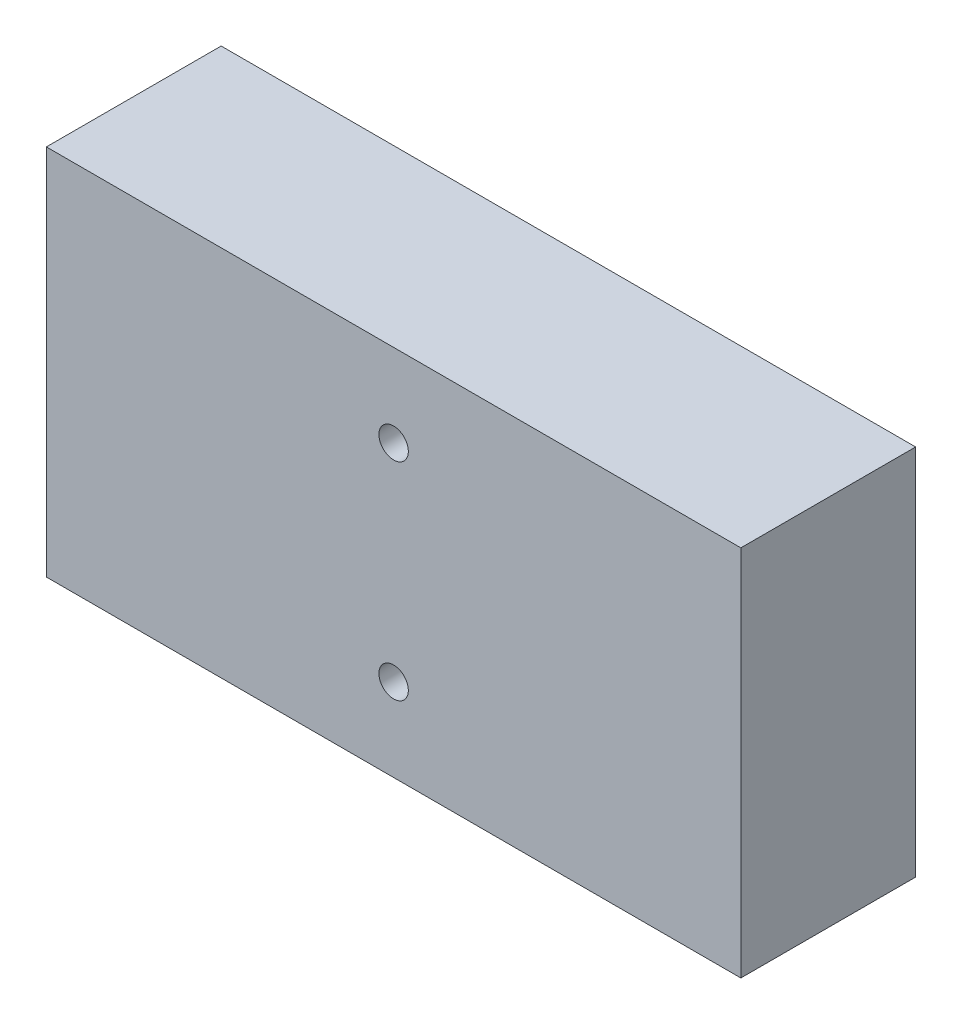
ISO-10303-21;
HEADER;
FILE_DESCRIPTION(('STEP AP214'),'2;1');
FILE_NAME('part.step','',(''),(''),'','','');
FILE_SCHEMA(('AUTOMOTIVE_DESIGN { 1 0 10303 214 1 1 1 1 }'));
ENDSEC;
DATA;
#1=APPLICATION_CONTEXT('core data for automotive mechanical design processes');
#2=APPLICATION_PROTOCOL_DEFINITION('international standard','automotive_design',2000,#1);
#3=PRODUCT_CONTEXT('',#1,'mechanical');
#4=PRODUCT('Part','Part','',(#3));
#5=PRODUCT_RELATED_PRODUCT_CATEGORY('part','',(#4));
#6=PRODUCT_DEFINITION_FORMATION('','',#4);
#7=PRODUCT_DEFINITION_CONTEXT('part definition',#1,'design');
#8=PRODUCT_DEFINITION('design','',#6,#7);
#9=PRODUCT_DEFINITION_SHAPE('','',#8);
#10=(LENGTH_UNIT() NAMED_UNIT(*) SI_UNIT(.MILLI.,.METRE.));
#11=(NAMED_UNIT(*) PLANE_ANGLE_UNIT() SI_UNIT($,.RADIAN.));
#12=(NAMED_UNIT(*) SI_UNIT($,.STERADIAN.) SOLID_ANGLE_UNIT());
#13=UNCERTAINTY_MEASURE_WITH_UNIT(LENGTH_MEASURE(1.E-05),#10,'distance_accuracy_value','');
#14=(GEOMETRIC_REPRESENTATION_CONTEXT(3) GLOBAL_UNCERTAINTY_ASSIGNED_CONTEXT((#13)) GLOBAL_UNIT_ASSIGNED_CONTEXT((#10,
#11,#12)) REPRESENTATION_CONTEXT('',''));
#15=CARTESIAN_POINT('',(0.,0.,0.));
#16=DIRECTION('',(0.,0.,1.));
#17=DIRECTION('',(1.,0.,0.));
#18=AXIS2_PLACEMENT_3D('',#15,#16,#17);
#19=CARTESIAN_POINT('',(0.,0.,19.));
#20=DIRECTION('',(0.,0.,-1.));
#21=DIRECTION('',(-1.,0.,0.));
#22=AXIS2_PLACEMENT_3D('',#19,#20,#21);
#23=PLANE('',#22);
#24=DIRECTION('',(0.,1.,0.));
#25=VECTOR('',#24,1.);
#26=CARTESIAN_POINT('',(37.75,-20.25,19.));
#27=LINE('',#26,#25);
#28=CARTESIAN_POINT('',(37.75,-20.25,19.));
#29=VERTEX_POINT('',#28);
#30=CARTESIAN_POINT('',(37.75,20.25,19.));
#31=VERTEX_POINT('',#30);
#32=EDGE_CURVE('E91',#29,#31,#27,.T.);
#33=ORIENTED_EDGE('',*,*,#32,.T.);
#34=DIRECTION('',(-1.,0.,0.));
#35=VECTOR('',#34,1.);
#36=CARTESIAN_POINT('',(-37.75,20.25,19.));
#37=LINE('',#36,#35);
#38=CARTESIAN_POINT('',(-37.75,20.25,19.));
#39=VERTEX_POINT('',#38);
#40=EDGE_CURVE('E86',#31,#39,#37,.T.);
#41=ORIENTED_EDGE('',*,*,#40,.T.);
#42=DIRECTION('',(0.,-1.,0.));
#43=VECTOR('',#42,1.);
#44=CARTESIAN_POINT('',(-37.75,-20.25,19.));
#45=LINE('',#44,#43);
#46=CARTESIAN_POINT('',(-37.75,-20.25,19.));
#47=VERTEX_POINT('',#46);
#48=EDGE_CURVE('E89',#39,#47,#45,.T.);
#49=ORIENTED_EDGE('',*,*,#48,.T.);
#50=DIRECTION('',(1.,0.,0.));
#51=VECTOR('',#50,1.);
#52=CARTESIAN_POINT('',(-37.75,-20.25,19.));
#53=LINE('',#52,#51);
#54=EDGE_CURVE('E56',#47,#29,#53,.T.);
#55=ORIENTED_EDGE('',*,*,#54,.T.);
#56=EDGE_LOOP('',(#33,#41,#49,#55));
#57=FACE_BOUND('',#56,.T.);
#58=CARTESIAN_POINT('',(0.,11.25,19.));
#59=DIRECTION('',(0.,0.,1.));
#60=DIRECTION('',(1.,0.,0.));
#61=AXIS2_PLACEMENT_3D('',#58,#59,#60);
#62=CIRCLE('',#61,1.6);
#63=CARTESIAN_POINT('',(1.6,11.25,19.));
#64=VERTEX_POINT('',#63);
#65=EDGE_CURVE('E106',#64,#64,#62,.T.);
#66=ORIENTED_EDGE('',*,*,#65,.F.);
#67=EDGE_LOOP('',(#66));
#68=FACE_BOUND('',#67,.T.);
#69=CARTESIAN_POINT('',(0.,-11.25,19.));
#70=DIRECTION('',(0.,0.,1.));
#71=DIRECTION('',(-1.,0.,0.));
#72=AXIS2_PLACEMENT_3D('',#69,#70,#71);
#73=CIRCLE('',#72,1.6);
#74=CARTESIAN_POINT('',(-1.6,-11.25,19.));
#75=VERTEX_POINT('',#74);
#76=EDGE_CURVE('E121',#75,#75,#73,.T.);
#77=ORIENTED_EDGE('',*,*,#76,.F.);
#78=EDGE_LOOP('',(#77));
#79=FACE_BOUND('',#78,.T.);
#80=ADVANCED_FACE('F39',(#57,#68,#79),#23,.F.);
#81=CARTESIAN_POINT('',(0.,0.,0.));
#82=DIRECTION('',(0.,0.,-1.));
#83=DIRECTION('',(-1.,0.,0.));
#84=AXIS2_PLACEMENT_3D('',#81,#82,#83);
#85=PLANE('',#84);
#86=CARTESIAN_POINT('',(0.,11.25,0.));
#87=DIRECTION('',(0.,0.,1.));
#88=DIRECTION('',(1.,0.,0.));
#89=AXIS2_PLACEMENT_3D('',#86,#87,#88);
#90=CIRCLE('',#89,1.6);
#91=CARTESIAN_POINT('',(1.6,11.25,0.));
#92=VERTEX_POINT('',#91);
#93=EDGE_CURVE('E118',#92,#92,#90,.T.);
#94=ORIENTED_EDGE('',*,*,#93,.T.);
#95=EDGE_LOOP('',(#94));
#96=FACE_BOUND('',#95,.T.);
#97=DIRECTION('',(0.,1.,0.));
#98=VECTOR('',#97,1.);
#99=CARTESIAN_POINT('',(37.75,-20.25,0.));
#100=LINE('',#99,#98);
#101=CARTESIAN_POINT('',(37.75,-20.25,0.));
#102=VERTEX_POINT('',#101);
#103=CARTESIAN_POINT('',(37.75,20.25,0.));
#104=VERTEX_POINT('',#103);
#105=EDGE_CURVE('E103',#102,#104,#100,.T.);
#106=ORIENTED_EDGE('',*,*,#105,.F.);
#107=DIRECTION('',(1.,0.,0.));
#108=VECTOR('',#107,1.);
#109=CARTESIAN_POINT('',(-37.75,-20.25,0.));
#110=LINE('',#109,#108);
#111=CARTESIAN_POINT('',(-37.75,-20.25,0.));
#112=VERTEX_POINT('',#111);
#113=EDGE_CURVE('E79',#112,#102,#110,.T.);
#114=ORIENTED_EDGE('',*,*,#113,.F.);
#115=DIRECTION('',(0.,-1.,0.));
#116=VECTOR('',#115,1.);
#117=CARTESIAN_POINT('',(-37.75,-20.25,0.));
#118=LINE('',#117,#116);
#119=CARTESIAN_POINT('',(-37.75,20.25,0.));
#120=VERTEX_POINT('',#119);
#121=EDGE_CURVE('E73',#120,#112,#118,.T.);
#122=ORIENTED_EDGE('',*,*,#121,.F.);
#123=DIRECTION('',(-1.,0.,0.));
#124=VECTOR('',#123,1.);
#125=CARTESIAN_POINT('',(-37.75,20.25,0.));
#126=LINE('',#125,#124);
#127=EDGE_CURVE('E95',#104,#120,#126,.T.);
#128=ORIENTED_EDGE('',*,*,#127,.F.);
#129=EDGE_LOOP('',(#106,#114,#122,#128));
#130=FACE_BOUND('',#129,.T.);
#131=CARTESIAN_POINT('',(0.,-11.25,0.));
#132=DIRECTION('',(0.,0.,1.));
#133=DIRECTION('',(-1.,0.,0.));
#134=AXIS2_PLACEMENT_3D('',#131,#132,#133);
#135=CIRCLE('',#134,1.6);
#136=CARTESIAN_POINT('',(-1.6,-11.25,0.));
#137=VERTEX_POINT('',#136);
#138=EDGE_CURVE('E124',#137,#137,#135,.T.);
#139=ORIENTED_EDGE('',*,*,#138,.T.);
#140=EDGE_LOOP('',(#139));
#141=FACE_BOUND('',#140,.T.);
#142=ADVANCED_FACE('F114',(#96,#130,#141),#85,.T.);
#143=CARTESIAN_POINT('',(37.75,-20.25,19.));
#144=DIRECTION('',(-1.,0.,0.));
#145=DIRECTION('',(0.,0.,1.));
#146=AXIS2_PLACEMENT_3D('',#143,#144,#145);
#147=PLANE('',#146);
#148=ORIENTED_EDGE('',*,*,#105,.T.);
#149=DIRECTION('',(0.,0.,-1.));
#150=VECTOR('',#149,1.);
#151=CARTESIAN_POINT('',(37.75,20.25,19.));
#152=LINE('',#151,#150);
#153=EDGE_CURVE('E11',#31,#104,#152,.T.);
#154=ORIENTED_EDGE('',*,*,#153,.F.);
#155=ORIENTED_EDGE('',*,*,#32,.F.);
#156=DIRECTION('',(0.,0.,-1.));
#157=VECTOR('',#156,1.);
#158=CARTESIAN_POINT('',(37.75,-20.25,19.));
#159=LINE('',#158,#157);
#160=EDGE_CURVE('E99',#29,#102,#159,.T.);
#161=ORIENTED_EDGE('',*,*,#160,.T.);
#162=EDGE_LOOP('',(#148,#154,#155,#161));
#163=FACE_BOUND('',#162,.T.);
#164=ADVANCED_FACE('F41',(#163),#147,.F.);
#165=CARTESIAN_POINT('',(-37.75,20.25,19.));
#166=DIRECTION('',(0.,-1.,0.));
#167=DIRECTION('',(0.,0.,-1.));
#168=AXIS2_PLACEMENT_3D('',#165,#166,#167);
#169=PLANE('',#168);
#170=ORIENTED_EDGE('',*,*,#127,.T.);
#171=DIRECTION('',(0.,0.,-1.));
#172=VECTOR('',#171,1.);
#173=CARTESIAN_POINT('',(-37.75,20.25,19.));
#174=LINE('',#173,#172);
#175=EDGE_CURVE('E48',#39,#120,#174,.T.);
#176=ORIENTED_EDGE('',*,*,#175,.F.);
#177=ORIENTED_EDGE('',*,*,#40,.F.);
#178=ORIENTED_EDGE('',*,*,#153,.T.);
#179=EDGE_LOOP('',(#170,#176,#177,#178));
#180=FACE_BOUND('',#179,.T.);
#181=ADVANCED_FACE('F94',(#180),#169,.F.);
#182=CARTESIAN_POINT('',(-37.75,-20.25,19.));
#183=DIRECTION('',(1.,0.,0.));
#184=DIRECTION('',(0.,0.,-1.));
#185=AXIS2_PLACEMENT_3D('',#182,#183,#184);
#186=PLANE('',#185);
#187=ORIENTED_EDGE('',*,*,#121,.T.);
#188=DIRECTION('',(0.,0.,-1.));
#189=VECTOR('',#188,1.);
#190=CARTESIAN_POINT('',(-37.75,-20.25,19.));
#191=LINE('',#190,#189);
#192=EDGE_CURVE('E96',#47,#112,#191,.T.);
#193=ORIENTED_EDGE('',*,*,#192,.F.);
#194=ORIENTED_EDGE('',*,*,#48,.F.);
#195=ORIENTED_EDGE('',*,*,#175,.T.);
#196=EDGE_LOOP('',(#187,#193,#194,#195));
#197=FACE_BOUND('',#196,.T.);
#198=ADVANCED_FACE('F97',(#197),#186,.F.);
#199=CARTESIAN_POINT('',(-37.75,-20.25,19.));
#200=DIRECTION('',(0.,1.,0.));
#201=DIRECTION('',(0.,0.,1.));
#202=AXIS2_PLACEMENT_3D('',#199,#200,#201);
#203=PLANE('',#202);
#204=ORIENTED_EDGE('',*,*,#113,.T.);
#205=ORIENTED_EDGE('',*,*,#160,.F.);
#206=ORIENTED_EDGE('',*,*,#54,.F.);
#207=ORIENTED_EDGE('',*,*,#192,.T.);
#208=EDGE_LOOP('',(#204,#205,#206,#207));
#209=FACE_BOUND('',#208,.T.);
#210=ADVANCED_FACE('F111',(#209),#203,.F.);
#211=CARTESIAN_POINT('',(0.,11.25,19.));
#212=DIRECTION('',(0.,0.,-1.));
#213=DIRECTION('',(-1.,0.,0.));
#214=AXIS2_PLACEMENT_3D('',#211,#212,#213);
#215=CYLINDRICAL_SURFACE('',#214,1.6);
#216=ORIENTED_EDGE('',*,*,#65,.T.);
#217=EDGE_LOOP('',(#216));
#218=FACE_BOUND('',#217,.T.);
#219=ORIENTED_EDGE('',*,*,#93,.F.);
#220=EDGE_LOOP('',(#219));
#221=FACE_BOUND('',#220,.T.);
#222=ADVANCED_FACE('F141',(#218,#221),#215,.F.);
#223=CARTESIAN_POINT('',(0.,-11.25,19.));
#224=DIRECTION('',(0.,0.,-1.));
#225=DIRECTION('',(-1.,0.,0.));
#226=AXIS2_PLACEMENT_3D('',#223,#224,#225);
#227=CYLINDRICAL_SURFACE('',#226,1.6);
#228=ORIENTED_EDGE('',*,*,#76,.T.);
#229=EDGE_LOOP('',(#228));
#230=FACE_BOUND('',#229,.T.);
#231=ORIENTED_EDGE('',*,*,#138,.F.);
#232=EDGE_LOOP('',(#231));
#233=FACE_BOUND('',#232,.T.);
#234=ADVANCED_FACE('F130',(#230,#233),#227,.F.);
#235=CLOSED_SHELL('',(#80,#142,#164,#181,#198,#210,#222,#234));
#236=MANIFOLD_SOLID_BREP('B2',#235);
#237=ADVANCED_BREP_SHAPE_REPRESENTATION('',(#18,#236),#14);
#238=SHAPE_DEFINITION_REPRESENTATION(#9,#237);
ENDSEC;
END-ISO-10303-21;
